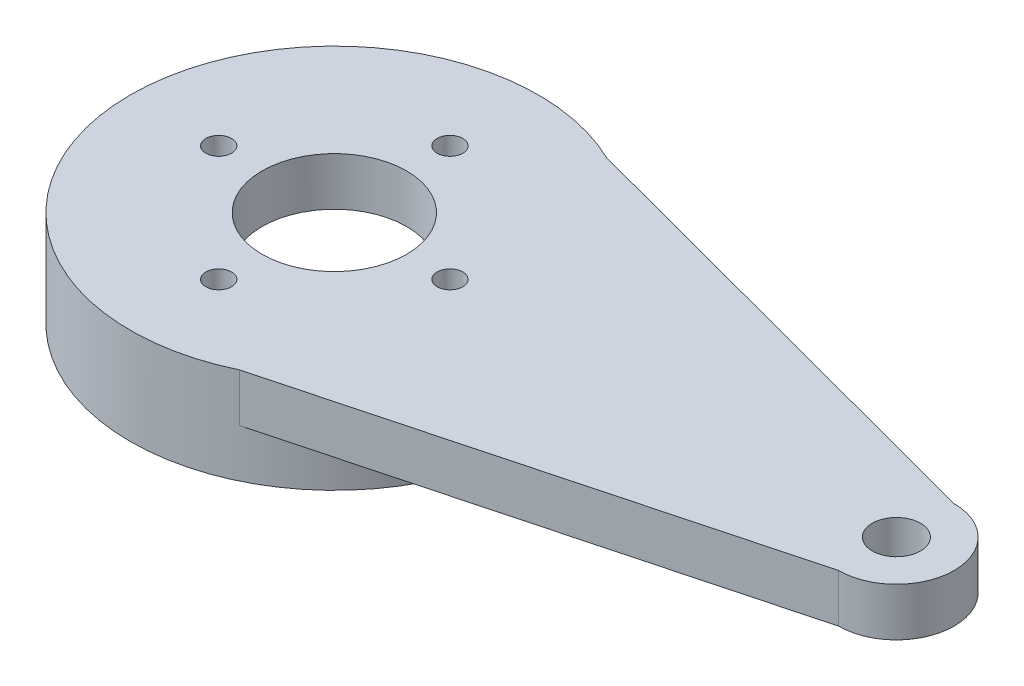
ISO-10303-21;
HEADER;
FILE_DESCRIPTION(('STEP AP214'),'2;1');
FILE_NAME('part.step','',(''),(''),'','','');
FILE_SCHEMA(('AUTOMOTIVE_DESIGN { 1 0 10303 214 1 1 1 1 }'));
ENDSEC;
DATA;
#1=APPLICATION_CONTEXT('core data for automotive mechanical design processes');
#2=APPLICATION_PROTOCOL_DEFINITION('international standard','automotive_design',2000,#1);
#3=PRODUCT_CONTEXT('',#1,'mechanical');
#4=PRODUCT('Part','Part','',(#3));
#5=PRODUCT_RELATED_PRODUCT_CATEGORY('part','',(#4));
#6=PRODUCT_DEFINITION_FORMATION('','',#4);
#7=PRODUCT_DEFINITION_CONTEXT('part definition',#1,'design');
#8=PRODUCT_DEFINITION('design','',#6,#7);
#9=PRODUCT_DEFINITION_SHAPE('','',#8);
#10=(LENGTH_UNIT() NAMED_UNIT(*) SI_UNIT(.MILLI.,.METRE.));
#11=(NAMED_UNIT(*) PLANE_ANGLE_UNIT() SI_UNIT($,.RADIAN.));
#12=(NAMED_UNIT(*) SI_UNIT($,.STERADIAN.) SOLID_ANGLE_UNIT());
#13=UNCERTAINTY_MEASURE_WITH_UNIT(LENGTH_MEASURE(1.E-05),#10,'distance_accuracy_value','');
#14=(GEOMETRIC_REPRESENTATION_CONTEXT(3) GLOBAL_UNCERTAINTY_ASSIGNED_CONTEXT((#13)) GLOBAL_UNIT_ASSIGNED_CONTEXT((#10,
#11,#12)) REPRESENTATION_CONTEXT('',''));
#15=CARTESIAN_POINT('',(0.,0.,0.));
#16=DIRECTION('',(0.,0.,1.));
#17=DIRECTION('',(1.,0.,0.));
#18=AXIS2_PLACEMENT_3D('',#15,#16,#17);
#19=CARTESIAN_POINT('',(0.,0.,0.));
#20=DIRECTION('',(0.,1.,0.));
#21=DIRECTION('',(0.,0.,1.));
#22=AXIS2_PLACEMENT_3D('',#19,#20,#21);
#23=PLANE('',#22);
#24=CARTESIAN_POINT('',(0.,0.,0.));
#25=DIRECTION('',(0.,-1.,0.));
#26=DIRECTION('',(0.,0.,-1.));
#27=AXIS2_PLACEMENT_3D('',#24,#25,#26);
#28=CIRCLE('',#27,4.5);
#29=CARTESIAN_POINT('',(0.,0.,-4.5));
#30=VERTEX_POINT('',#29);
#31=EDGE_CURVE('E175',#30,#30,#28,.T.);
#32=ORIENTED_EDGE('',*,*,#31,.F.);
#33=EDGE_LOOP('',(#32));
#34=FACE_BOUND('',#33,.T.);
#35=CARTESIAN_POINT('',(0.,0.,7.2));
#36=DIRECTION('',(0.,1.,0.));
#37=DIRECTION('',(0.,0.,1.));
#38=AXIS2_PLACEMENT_3D('',#35,#36,#37);
#39=CIRCLE('',#38,0.8);
#40=CARTESIAN_POINT('',(0.,0.,8.));
#41=VERTEX_POINT('',#40);
#42=EDGE_CURVE('E145',#41,#41,#39,.T.);
#43=ORIENTED_EDGE('',*,*,#42,.T.);
#44=EDGE_LOOP('',(#43));
#45=FACE_BOUND('',#44,.T.);
#46=CARTESIAN_POINT('',(7.2000000000002,0.,2.03287907341032E-13));
#47=DIRECTION('',(0.,1.,0.));
#48=DIRECTION('',(0.,0.,1.));
#49=AXIS2_PLACEMENT_3D('',#46,#47,#48);
#50=CIRCLE('',#49,0.800000000000159);
#51=CARTESIAN_POINT('',(7.2000000000002,0.,0.800000000000362));
#52=VERTEX_POINT('',#51);
#53=EDGE_CURVE('E149',#52,#52,#50,.T.);
#54=ORIENTED_EDGE('',*,*,#53,.T.);
#55=EDGE_LOOP('',(#54));
#56=FACE_BOUND('',#55,.T.);
#57=CARTESIAN_POINT('',(4.06630024790688E-13,0.,-7.2));
#58=DIRECTION('',(0.,1.,0.));
#59=DIRECTION('',(0.,0.,1.));
#60=AXIS2_PLACEMENT_3D('',#57,#58,#59);
#61=CIRCLE('',#60,0.800000000000437);
#62=CARTESIAN_POINT('',(4.06630024790688E-13,0.,-6.39999999999956));
#63=VERTEX_POINT('',#62);
#64=EDGE_CURVE('E154',#63,#63,#61,.T.);
#65=ORIENTED_EDGE('',*,*,#64,.T.);
#66=EDGE_LOOP('',(#65));
#67=FACE_BOUND('',#66,.T.);
#68=CARTESIAN_POINT('',(-7.1999999999998,0.,-2.0415526907902E-13));
#69=DIRECTION('',(0.,1.,0.));
#70=DIRECTION('',(0.,0.,1.));
#71=AXIS2_PLACEMENT_3D('',#68,#69,#70);
#72=CIRCLE('',#71,0.800000000000327);
#73=CARTESIAN_POINT('',(-7.1999999999998,0.,0.800000000000123));
#74=VERTEX_POINT('',#73);
#75=EDGE_CURVE('E158',#74,#74,#72,.T.);
#76=ORIENTED_EDGE('',*,*,#75,.T.);
#77=EDGE_LOOP('',(#76));
#78=FACE_BOUND('',#77,.T.);
#79=CARTESIAN_POINT('',(0.,0.,0.));
#80=DIRECTION('',(0.,1.,0.));
#81=DIRECTION('',(0.,0.,1.));
#82=AXIS2_PLACEMENT_3D('',#79,#80,#81);
#83=CIRCLE('',#82,10.7);
#84=CARTESIAN_POINT('',(0.,0.,10.7));
#85=VERTEX_POINT('',#84);
#86=EDGE_CURVE('E11',#85,#85,#83,.T.);
#87=ORIENTED_EDGE('',*,*,#86,.F.);
#88=EDGE_LOOP('',(#87));
#89=FACE_BOUND('',#88,.T.);
#90=ADVANCED_FACE('F44',(#34,#45,#56,#67,#78,#89),#23,.F.);
#91=CARTESIAN_POINT('',(0.,3.,0.));
#92=DIRECTION('',(0.,-1.,0.));
#93=DIRECTION('',(0.,0.,-1.));
#94=AXIS2_PLACEMENT_3D('',#91,#92,#93);
#95=CYLINDRICAL_SURFACE('',#94,12.7);
#96=DIRECTION('',(0.,-1.,0.));
#97=VECTOR('',#96,1.);
#98=CARTESIAN_POINT('',(5.52606625136872,3.,-11.434709956334));
#99=LINE('',#98,#97);
#100=CARTESIAN_POINT('',(5.52606625136872,3.,-11.434709956334));
#101=VERTEX_POINT('',#100);
#102=CARTESIAN_POINT('',(5.52606625136872,0.,-11.434709956334));
#103=VERTEX_POINT('',#102);
#104=EDGE_CURVE('E110',#101,#103,#99,.T.);
#105=ORIENTED_EDGE('',*,*,#104,.T.);
#106=CARTESIAN_POINT('',(0.,0.,0.));
#107=DIRECTION('',(0.,1.,0.));
#108=DIRECTION('',(0.,0.,1.));
#109=AXIS2_PLACEMENT_3D('',#106,#107,#108);
#110=CIRCLE('',#109,12.7);
#111=CARTESIAN_POINT('',(5.52606625136872,0.,11.434709956334));
#112=VERTEX_POINT('',#111);
#113=EDGE_CURVE('E95',#112,#103,#110,.T.);
#114=ORIENTED_EDGE('',*,*,#113,.F.);
#115=DIRECTION('',(0.,-1.,0.));
#116=VECTOR('',#115,1.);
#117=CARTESIAN_POINT('',(5.52606625136872,3.,11.434709956334));
#118=LINE('',#117,#116);
#119=CARTESIAN_POINT('',(5.52606625136872,3.,11.434709956334));
#120=VERTEX_POINT('',#119);
#121=EDGE_CURVE('E55',#120,#112,#118,.T.);
#122=ORIENTED_EDGE('',*,*,#121,.F.);
#123=CARTESIAN_POINT('',(0.,3.,0.));
#124=DIRECTION('',(0.,1.,0.));
#125=DIRECTION('',(0.,0.,1.));
#126=AXIS2_PLACEMENT_3D('',#123,#124,#125);
#127=CIRCLE('',#126,12.7);
#128=EDGE_CURVE('E88',#101,#120,#127,.T.);
#129=ORIENTED_EDGE('',*,*,#128,.F.);
#130=EDGE_LOOP('',(#105,#114,#122,#129));
#131=FACE_BOUND('',#130,.T.);
#132=CARTESIAN_POINT('',(0.,-3.,0.));
#133=DIRECTION('',(0.,1.,0.));
#134=DIRECTION('',(0.,0.,1.));
#135=AXIS2_PLACEMENT_3D('',#132,#133,#134);
#136=CIRCLE('',#135,12.7);
#137=CARTESIAN_POINT('',(0.,-3.,12.7));
#138=VERTEX_POINT('',#137);
#139=EDGE_CURVE('E150',#138,#138,#136,.T.);
#140=ORIENTED_EDGE('',*,*,#139,.T.);
#141=EDGE_LOOP('',(#140));
#142=FACE_BOUND('',#141,.T.);
#143=ADVANCED_FACE('F115',(#131,#142),#95,.T.);
#144=CARTESIAN_POINT('',(3.20365485186224,3.,12.0520493271013));
#145=DIRECTION('',(0.256897077261084,0.,0.966438767690283));
#146=DIRECTION('',(0.966438767690283,0.,-0.256897077261084));
#147=AXIS2_PLACEMENT_3D('',#144,#145,#146);
#148=PLANE('',#147);
#149=DIRECTION('',(-0.966438767690283,0.,0.256897077261084));
#150=VECTOR('',#149,1.);
#151=CARTESIAN_POINT('',(3.20365485186224,0.,12.0520493271013));
#152=LINE('',#151,#150);
#153=CARTESIAN_POINT('',(35.,0.,3.6));
#154=VERTEX_POINT('',#153);
#155=EDGE_CURVE('E101',#154,#112,#152,.T.);
#156=ORIENTED_EDGE('',*,*,#155,.F.);
#157=DIRECTION('',(0.,-1.,0.));
#158=VECTOR('',#157,1.);
#159=CARTESIAN_POINT('',(35.,3.,3.6));
#160=LINE('',#159,#158);
#161=CARTESIAN_POINT('',(35.,3.,3.6));
#162=VERTEX_POINT('',#161);
#163=EDGE_CURVE('E79',#162,#154,#160,.T.);
#164=ORIENTED_EDGE('',*,*,#163,.F.);
#165=DIRECTION('',(-0.966438767690283,0.,0.256897077261084));
#166=VECTOR('',#165,1.);
#167=CARTESIAN_POINT('',(3.20365485186224,3.,12.0520493271013));
#168=LINE('',#167,#166);
#169=EDGE_CURVE('E132',#162,#120,#168,.T.);
#170=ORIENTED_EDGE('',*,*,#169,.T.);
#171=ORIENTED_EDGE('',*,*,#121,.T.);
#172=EDGE_LOOP('',(#156,#164,#170,#171));
#173=FACE_BOUND('',#172,.T.);
#174=ADVANCED_FACE('F131',(#173),#148,.T.);
#175=CARTESIAN_POINT('',(35.,3.,0.));
#176=DIRECTION('',(0.,-1.,0.));
#177=DIRECTION('',(0.,0.,-1.));
#178=AXIS2_PLACEMENT_3D('',#175,#176,#177);
#179=CYLINDRICAL_SURFACE('',#178,3.6);
#180=CARTESIAN_POINT('',(35.,0.,0.));
#181=DIRECTION('',(0.,1.,0.));
#182=DIRECTION('',(0.,0.,1.));
#183=AXIS2_PLACEMENT_3D('',#180,#181,#182);
#184=CIRCLE('',#183,3.6);
#185=CARTESIAN_POINT('',(35.,0.,-3.6));
#186=VERTEX_POINT('',#185);
#187=EDGE_CURVE('E83',#154,#186,#184,.T.);
#188=ORIENTED_EDGE('',*,*,#187,.T.);
#189=DIRECTION('',(0.,-1.,0.));
#190=VECTOR('',#189,1.);
#191=CARTESIAN_POINT('',(35.,3.,-3.6));
#192=LINE('',#191,#190);
#193=CARTESIAN_POINT('',(35.,3.,-3.6));
#194=VERTEX_POINT('',#193);
#195=EDGE_CURVE('E111',#194,#186,#192,.T.);
#196=ORIENTED_EDGE('',*,*,#195,.F.);
#197=CARTESIAN_POINT('',(35.,3.,0.));
#198=DIRECTION('',(0.,1.,0.));
#199=DIRECTION('',(0.,0.,1.));
#200=AXIS2_PLACEMENT_3D('',#197,#198,#199);
#201=CIRCLE('',#200,3.6);
#202=EDGE_CURVE('E134',#162,#194,#201,.T.);
#203=ORIENTED_EDGE('',*,*,#202,.F.);
#204=ORIENTED_EDGE('',*,*,#163,.T.);
#205=EDGE_LOOP('',(#188,#196,#203,#204));
#206=FACE_BOUND('',#205,.T.);
#207=ADVANCED_FACE('F250',(#206),#179,.T.);
#208=CARTESIAN_POINT('',(3.20365485186224,3.,-12.0520493271013));
#209=DIRECTION('',(-0.256897077261084,0.,0.966438767690283));
#210=DIRECTION('',(0.966438767690283,0.,0.256897077261084));
#211=AXIS2_PLACEMENT_3D('',#208,#209,#210);
#212=PLANE('',#211);
#213=DIRECTION('',(-0.966438767690283,0.,-0.256897077261084));
#214=VECTOR('',#213,1.);
#215=CARTESIAN_POINT('',(3.20365485186224,0.,-12.0520493271013));
#216=LINE('',#215,#214);
#217=EDGE_CURVE('E99',#186,#103,#216,.T.);
#218=ORIENTED_EDGE('',*,*,#217,.T.);
#219=ORIENTED_EDGE('',*,*,#104,.F.);
#220=DIRECTION('',(-0.966438767690283,0.,-0.256897077261084));
#221=VECTOR('',#220,1.);
#222=CARTESIAN_POINT('',(3.20365485186224,3.,-12.0520493271013));
#223=LINE('',#222,#221);
#224=EDGE_CURVE('E64',#194,#101,#223,.T.);
#225=ORIENTED_EDGE('',*,*,#224,.F.);
#226=ORIENTED_EDGE('',*,*,#195,.T.);
#227=EDGE_LOOP('',(#218,#219,#225,#226));
#228=FACE_BOUND('',#227,.T.);
#229=ADVANCED_FACE('F109',(#228),#212,.F.);
#230=CARTESIAN_POINT('',(-7.1999999999998,3.,-2.0415526907902E-13));
#231=DIRECTION('',(0.,-1.,0.));
#232=DIRECTION('',(0.,0.,-1.));
#233=AXIS2_PLACEMENT_3D('',#230,#231,#232);
#234=CYLINDRICAL_SURFACE('',#233,0.800000000000327);
#235=CARTESIAN_POINT('',(-7.1999999999998,3.,-2.0415526907902E-13));
#236=DIRECTION('',(0.,1.,0.));
#237=DIRECTION('',(0.,0.,1.));
#238=AXIS2_PLACEMENT_3D('',#235,#236,#237);
#239=CIRCLE('',#238,0.800000000000327);
#240=CARTESIAN_POINT('',(-7.1999999999998,3.,0.800000000000123));
#241=VERTEX_POINT('',#240);
#242=EDGE_CURVE('E139',#241,#241,#239,.T.);
#243=ORIENTED_EDGE('',*,*,#242,.T.);
#244=EDGE_LOOP('',(#243));
#245=FACE_BOUND('',#244,.T.);
#246=ORIENTED_EDGE('',*,*,#75,.F.);
#247=EDGE_LOOP('',(#246));
#248=FACE_BOUND('',#247,.T.);
#249=ADVANCED_FACE('F196',(#245,#248),#234,.F.);
#250=CARTESIAN_POINT('',(4.06630024790688E-13,3.,-7.2));
#251=DIRECTION('',(0.,-1.,0.));
#252=DIRECTION('',(0.,0.,-1.));
#253=AXIS2_PLACEMENT_3D('',#250,#251,#252);
#254=CYLINDRICAL_SURFACE('',#253,0.800000000000437);
#255=CARTESIAN_POINT('',(4.06630024790688E-13,3.,-7.2));
#256=DIRECTION('',(0.,1.,0.));
#257=DIRECTION('',(0.,0.,1.));
#258=AXIS2_PLACEMENT_3D('',#255,#256,#257);
#259=CIRCLE('',#258,0.800000000000437);
#260=CARTESIAN_POINT('',(4.06630024790688E-13,3.,-6.39999999999956));
#261=VERTEX_POINT('',#260);
#262=EDGE_CURVE('E189',#261,#261,#259,.T.);
#263=ORIENTED_EDGE('',*,*,#262,.T.);
#264=EDGE_LOOP('',(#263));
#265=FACE_BOUND('',#264,.T.);
#266=ORIENTED_EDGE('',*,*,#64,.F.);
#267=EDGE_LOOP('',(#266));
#268=FACE_BOUND('',#267,.T.);
#269=ADVANCED_FACE('F241',(#265,#268),#254,.F.);
#270=CARTESIAN_POINT('',(7.2000000000002,3.,2.03287907341032E-13));
#271=DIRECTION('',(0.,-1.,0.));
#272=DIRECTION('',(0.,0.,-1.));
#273=AXIS2_PLACEMENT_3D('',#270,#271,#272);
#274=CYLINDRICAL_SURFACE('',#273,0.800000000000159);
#275=CARTESIAN_POINT('',(7.2000000000002,3.,2.03287907341032E-13));
#276=DIRECTION('',(0.,1.,0.));
#277=DIRECTION('',(0.,0.,1.));
#278=AXIS2_PLACEMENT_3D('',#275,#276,#277);
#279=CIRCLE('',#278,0.800000000000159);
#280=CARTESIAN_POINT('',(7.2000000000002,3.,0.800000000000362));
#281=VERTEX_POINT('',#280);
#282=EDGE_CURVE('E185',#281,#281,#279,.T.);
#283=ORIENTED_EDGE('',*,*,#282,.T.);
#284=EDGE_LOOP('',(#283));
#285=FACE_BOUND('',#284,.T.);
#286=ORIENTED_EDGE('',*,*,#53,.F.);
#287=EDGE_LOOP('',(#286));
#288=FACE_BOUND('',#287,.T.);
#289=ADVANCED_FACE('F247',(#285,#288),#274,.F.);
#290=CARTESIAN_POINT('',(0.,3.,7.2));
#291=DIRECTION('',(0.,-1.,0.));
#292=DIRECTION('',(0.,0.,-1.));
#293=AXIS2_PLACEMENT_3D('',#290,#291,#292);
#294=CYLINDRICAL_SURFACE('',#293,0.8);
#295=CARTESIAN_POINT('',(0.,3.,7.2));
#296=DIRECTION('',(0.,1.,0.));
#297=DIRECTION('',(0.,0.,1.));
#298=AXIS2_PLACEMENT_3D('',#295,#296,#297);
#299=CIRCLE('',#298,0.8);
#300=CARTESIAN_POINT('',(0.,3.,8.));
#301=VERTEX_POINT('',#300);
#302=EDGE_CURVE('E181',#301,#301,#299,.T.);
#303=ORIENTED_EDGE('',*,*,#302,.T.);
#304=EDGE_LOOP('',(#303));
#305=FACE_BOUND('',#304,.T.);
#306=ORIENTED_EDGE('',*,*,#42,.F.);
#307=EDGE_LOOP('',(#306));
#308=FACE_BOUND('',#307,.T.);
#309=ADVANCED_FACE('F46',(#305,#308),#294,.F.);
#310=CARTESIAN_POINT('',(35.,3.,0.));
#311=DIRECTION('',(0.,-1.,0.));
#312=DIRECTION('',(0.,0.,-1.));
#313=AXIS2_PLACEMENT_3D('',#310,#311,#312);
#314=CYLINDRICAL_SURFACE('',#313,1.5);
#315=CARTESIAN_POINT('',(35.,3.,0.));
#316=DIRECTION('',(0.,1.,0.));
#317=DIRECTION('',(0.,0.,1.));
#318=AXIS2_PLACEMENT_3D('',#315,#316,#317);
#319=CIRCLE('',#318,1.5);
#320=CARTESIAN_POINT('',(35.,3.,1.5));
#321=VERTEX_POINT('',#320);
#322=EDGE_CURVE('E118',#321,#321,#319,.T.);
#323=ORIENTED_EDGE('',*,*,#322,.T.);
#324=EDGE_LOOP('',(#323));
#325=FACE_BOUND('',#324,.T.);
#326=CARTESIAN_POINT('',(35.,0.,0.));
#327=DIRECTION('',(0.,1.,0.));
#328=DIRECTION('',(0.,0.,1.));
#329=AXIS2_PLACEMENT_3D('',#326,#327,#328);
#330=CIRCLE('',#329,1.5);
#331=CARTESIAN_POINT('',(35.,0.,1.5));
#332=VERTEX_POINT('',#331);
#333=EDGE_CURVE('E113',#332,#332,#330,.T.);
#334=ORIENTED_EDGE('',*,*,#333,.F.);
#335=EDGE_LOOP('',(#334));
#336=FACE_BOUND('',#335,.T.);
#337=ADVANCED_FACE('F201',(#325,#336),#314,.F.);
#338=CARTESIAN_POINT('',(0.,3.,0.));
#339=DIRECTION('',(0.,1.,0.));
#340=DIRECTION('',(0.,0.,1.));
#341=AXIS2_PLACEMENT_3D('',#338,#339,#340);
#342=PLANE('',#341);
#343=CARTESIAN_POINT('',(0.,3.,0.));
#344=DIRECTION('',(0.,1.,0.));
#345=DIRECTION('',(0.,0.,1.));
#346=AXIS2_PLACEMENT_3D('',#343,#344,#345);
#347=CIRCLE('',#346,4.5);
#348=CARTESIAN_POINT('',(0.,3.,4.5));
#349=VERTEX_POINT('',#348);
#350=EDGE_CURVE('E48',#349,#349,#347,.T.);
#351=ORIENTED_EDGE('',*,*,#350,.F.);
#352=EDGE_LOOP('',(#351));
#353=FACE_BOUND('',#352,.T.);
#354=ORIENTED_EDGE('',*,*,#302,.F.);
#355=EDGE_LOOP('',(#354));
#356=FACE_BOUND('',#355,.T.);
#357=ORIENTED_EDGE('',*,*,#282,.F.);
#358=EDGE_LOOP('',(#357));
#359=FACE_BOUND('',#358,.T.);
#360=ORIENTED_EDGE('',*,*,#262,.F.);
#361=EDGE_LOOP('',(#360));
#362=FACE_BOUND('',#361,.T.);
#363=ORIENTED_EDGE('',*,*,#242,.F.);
#364=EDGE_LOOP('',(#363));
#365=FACE_BOUND('',#364,.T.);
#366=ORIENTED_EDGE('',*,*,#128,.T.);
#367=ORIENTED_EDGE('',*,*,#169,.F.);
#368=ORIENTED_EDGE('',*,*,#202,.T.);
#369=ORIENTED_EDGE('',*,*,#224,.T.);
#370=EDGE_LOOP('',(#366,#367,#368,#369));
#371=FACE_BOUND('',#370,.T.);
#372=ORIENTED_EDGE('',*,*,#322,.F.);
#373=EDGE_LOOP('',(#372));
#374=FACE_BOUND('',#373,.T.);
#375=ADVANCED_FACE('F199',(#353,#356,#359,#362,#365,#371,#374),#342,.T.);
#376=ORIENTED_EDGE('',*,*,#155,.T.);
#377=ORIENTED_EDGE('',*,*,#113,.T.);
#378=ORIENTED_EDGE('',*,*,#217,.F.);
#379=ORIENTED_EDGE('',*,*,#187,.F.);
#380=EDGE_LOOP('',(#376,#377,#378,#379));
#381=FACE_BOUND('',#380,.T.);
#382=ORIENTED_EDGE('',*,*,#333,.T.);
#383=EDGE_LOOP('',(#382));
#384=FACE_BOUND('',#383,.T.);
#385=ADVANCED_FACE('F97',(#381,#384),#23,.F.);
#386=CARTESIAN_POINT('',(0.,-3.,0.));
#387=DIRECTION('',(0.,1.,0.));
#388=DIRECTION('',(0.,0.,1.));
#389=AXIS2_PLACEMENT_3D('',#386,#387,#388);
#390=CYLINDRICAL_SURFACE('',#389,10.7);
#391=CARTESIAN_POINT('',(0.,-3.,0.));
#392=DIRECTION('',(0.,1.,0.));
#393=DIRECTION('',(0.,0.,1.));
#394=AXIS2_PLACEMENT_3D('',#391,#392,#393);
#395=CIRCLE('',#394,10.7);
#396=CARTESIAN_POINT('',(0.,-3.,10.7));
#397=VERTEX_POINT('',#396);
#398=EDGE_CURVE('E106',#397,#397,#395,.T.);
#399=ORIENTED_EDGE('',*,*,#398,.F.);
#400=EDGE_LOOP('',(#399));
#401=FACE_BOUND('',#400,.T.);
#402=ORIENTED_EDGE('',*,*,#86,.T.);
#403=EDGE_LOOP('',(#402));
#404=FACE_BOUND('',#403,.T.);
#405=ADVANCED_FACE('F213',(#401,#404),#390,.F.);
#406=CARTESIAN_POINT('',(0.,-3.,0.));
#407=DIRECTION('',(0.,1.,0.));
#408=DIRECTION('',(0.,0.,1.));
#409=AXIS2_PLACEMENT_3D('',#406,#407,#408);
#410=PLANE('',#409);
#411=ORIENTED_EDGE('',*,*,#398,.T.);
#412=EDGE_LOOP('',(#411));
#413=FACE_BOUND('',#412,.T.);
#414=ORIENTED_EDGE('',*,*,#139,.F.);
#415=EDGE_LOOP('',(#414));
#416=FACE_BOUND('',#415,.T.);
#417=ADVANCED_FACE('F219',(#413,#416),#410,.F.);
#418=CARTESIAN_POINT('',(0.,10.,0.));
#419=DIRECTION('',(0.,-1.,0.));
#420=DIRECTION('',(0.,0.,-1.));
#421=AXIS2_PLACEMENT_3D('',#418,#419,#420);
#422=CYLINDRICAL_SURFACE('',#421,4.5);
#423=ORIENTED_EDGE('',*,*,#350,.T.);
#424=EDGE_LOOP('',(#423));
#425=FACE_BOUND('',#424,.T.);
#426=ORIENTED_EDGE('',*,*,#31,.T.);
#427=EDGE_LOOP('',(#426));
#428=FACE_BOUND('',#427,.T.);
#429=ADVANCED_FACE('F285',(#425,#428),#422,.F.);
#430=CLOSED_SHELL('',(#90,#143,#174,#207,#229,#249,#269,#289,#309,#337,#375,#385,#405,#417,#429));
#431=MANIFOLD_SOLID_BREP('B2',#430);
#432=ADVANCED_BREP_SHAPE_REPRESENTATION('',(#18,#431),#14);
#433=SHAPE_DEFINITION_REPRESENTATION(#9,#432);
ENDSEC;
END-ISO-10303-21;
